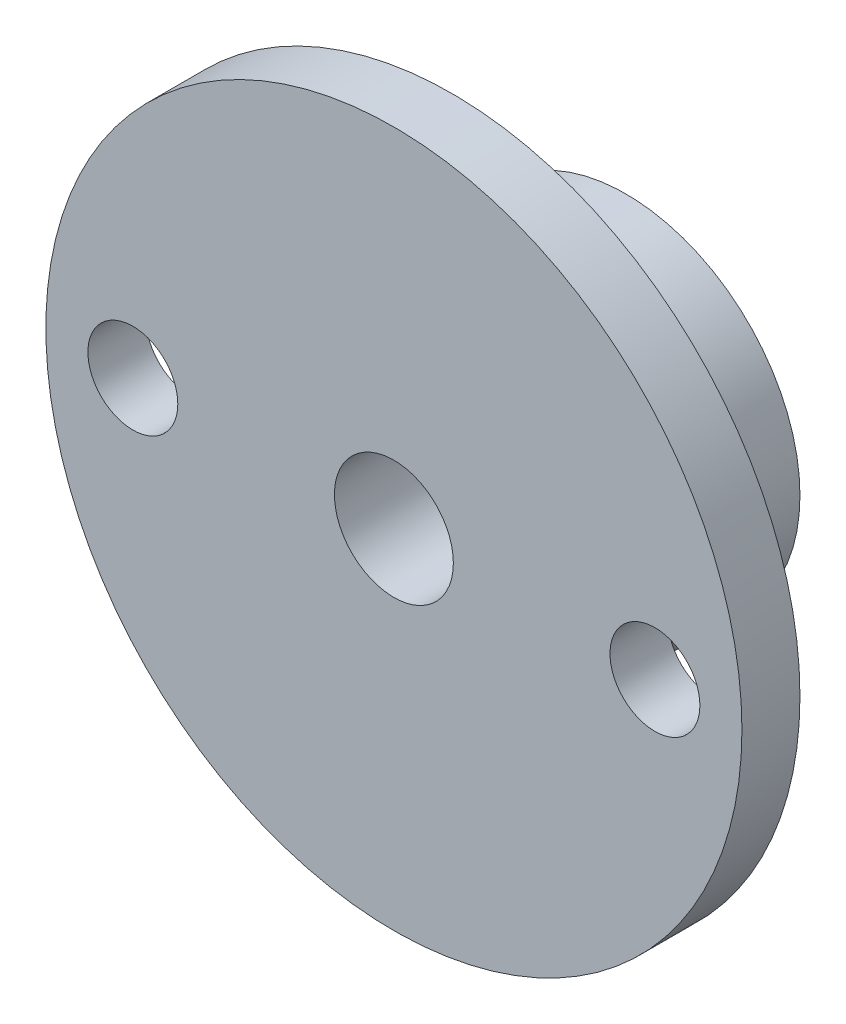
ISO-10303-21;
HEADER;
FILE_DESCRIPTION(('STEP AP214'),'2;1');
FILE_NAME('part.step','',(''),(''),'','','');
FILE_SCHEMA(('AUTOMOTIVE_DESIGN { 1 0 10303 214 1 1 1 1 }'));
ENDSEC;
DATA;
#1=APPLICATION_CONTEXT('core data for automotive mechanical design processes');
#2=APPLICATION_PROTOCOL_DEFINITION('international standard','automotive_design',2000,#1);
#3=PRODUCT_CONTEXT('',#1,'mechanical');
#4=PRODUCT('Part','Part','',(#3));
#5=PRODUCT_RELATED_PRODUCT_CATEGORY('part','',(#4));
#6=PRODUCT_DEFINITION_FORMATION('','',#4);
#7=PRODUCT_DEFINITION_CONTEXT('part definition',#1,'design');
#8=PRODUCT_DEFINITION('design','',#6,#7);
#9=PRODUCT_DEFINITION_SHAPE('','',#8);
#10=(LENGTH_UNIT() NAMED_UNIT(*) SI_UNIT(.MILLI.,.METRE.));
#11=(NAMED_UNIT(*) PLANE_ANGLE_UNIT() SI_UNIT($,.RADIAN.));
#12=(NAMED_UNIT(*) SI_UNIT($,.STERADIAN.) SOLID_ANGLE_UNIT());
#13=UNCERTAINTY_MEASURE_WITH_UNIT(LENGTH_MEASURE(1.E-05),#10,'distance_accuracy_value','');
#14=(GEOMETRIC_REPRESENTATION_CONTEXT(3) GLOBAL_UNCERTAINTY_ASSIGNED_CONTEXT((#13)) GLOBAL_UNIT_ASSIGNED_CONTEXT((#10,
#11,#12)) REPRESENTATION_CONTEXT('',''));
#15=CARTESIAN_POINT('',(0.,0.,0.));
#16=DIRECTION('',(0.,0.,1.));
#17=DIRECTION('',(1.,0.,0.));
#18=AXIS2_PLACEMENT_3D('',#15,#16,#17);
#19=CARTESIAN_POINT('',(0.,0.,6.));
#20=DIRECTION('',(0.,0.,-1.));
#21=DIRECTION('',(-1.,0.,0.));
#22=AXIS2_PLACEMENT_3D('',#19,#20,#21);
#23=CYLINDRICAL_SURFACE('',#22,6.);
#24=CARTESIAN_POINT('',(0.,-6.,4.5));
#25=CARTESIAN_POINT('',(0.0828760886697294,-5.99999859868013,4.49999767426184));
#26=CARTESIAN_POINT('',(0.165778157830762,-5.99826578131828,4.49310844922621));
#27=CARTESIAN_POINT('',(0.329206323770531,-5.99152113829892,4.465774848693));
#28=CARTESIAN_POINT('',(0.409731046870737,-5.98650745419968,4.44532279046215));
#29=CARTESIAN_POINT('',(0.566020872182575,-5.9737562633204,4.39156074653791));
#30=CARTESIAN_POINT('',(0.641791563430001,-5.96602202842087,4.35826620128472));
#31=CARTESIAN_POINT('',(0.786672131904424,-5.94865343807593,4.27981860995517));
#32=CARTESIAN_POINT('',(0.855781784348757,-5.9390190185405,4.23466516388106));
#33=CARTESIAN_POINT('',(0.986801927300918,-5.91867413591801,4.13279921034579));
#34=CARTESIAN_POINT('',(1.04855569006107,-5.90794707148533,4.07588842504082));
#35=CARTESIAN_POINT('',(1.1617489272033,-5.8867362011753,3.95254779509108));
#36=CARTESIAN_POINT('',(1.21318723694913,-5.87625242288349,3.8861168770535));
#37=CARTESIAN_POINT('',(1.30502654279903,-5.8565477569971,3.74440477326256));
#38=CARTESIAN_POINT('',(1.34525221592535,-5.84734794470605,3.6690067691896));
#39=CARTESIAN_POINT('',(1.41239690855053,-5.83149494812223,3.51225158834164));
#40=CARTESIAN_POINT('',(1.43931805543933,-5.82484135672789,3.43089536667424));
#41=CARTESIAN_POINT('',(1.47855483680429,-5.81500476717551,3.26625650179753));
#42=CARTESIAN_POINT('',(1.49115226833334,-5.81175491075426,3.1830451039502));
#43=CARTESIAN_POINT('',(1.50226177506785,-5.80889362537741,3.01563143098602));
#44=CARTESIAN_POINT('',(1.50077614181798,-5.80928160448644,2.93142931930139));
#45=CARTESIAN_POINT('',(1.48398652463928,-5.81359205496618,2.76658419225552));
#46=CARTESIAN_POINT('',(1.46901834019052,-5.81742863001879,2.68590437853491));
#47=CARTESIAN_POINT('',(1.4262241869031,-5.82806709676484,2.52823894908871));
#48=CARTESIAN_POINT('',(1.39839730206942,-5.83486919970697,2.45125359697102));
#49=CARTESIAN_POINT('',(1.33038947793715,-5.85075113904187,2.30226198374794));
#50=CARTESIAN_POINT('',(1.29008666723291,-5.85985327469421,2.23031382821045));
#51=CARTESIAN_POINT('',(1.19835627601495,-5.87929710846386,2.09408129024316));
#52=CARTESIAN_POINT('',(1.14692674880884,-5.88963902334735,2.02979825193275));
#53=CARTESIAN_POINT('',(1.03266342468122,-5.91075880539781,1.9087963843056));
#54=CARTESIAN_POINT('',(0.969546258165859,-5.92154069477971,1.85234550993865));
#55=CARTESIAN_POINT('',(0.834611917503699,-5.94205965578786,1.7507787575361));
#56=CARTESIAN_POINT('',(0.762794477707943,-5.95179669549415,1.70566322573644));
#57=CARTESIAN_POINT('',(0.612115888681391,-5.96917732094183,1.62794941377562));
#58=CARTESIAN_POINT('',(0.533231393208623,-5.97681360127725,1.59539465974557));
#59=CARTESIAN_POINT('',(0.370876008142882,-5.98907916991419,1.54408269429043));
#60=CARTESIAN_POINT('',(0.287405999150484,-5.99370903339281,1.52532284358186));
#61=CARTESIAN_POINT('',(0.120539970390026,-5.99935499271375,1.50254243444116));
#62=CARTESIAN_POINT('',(0.0371967199882084,-6.00046053508279,1.4981569739247));
#63=CARTESIAN_POINT('',(-0.129032874801509,-5.99918804814451,1.50324900205549));
#64=CARTESIAN_POINT('',(-0.211919259644596,-5.99681033241847,1.51272524279913));
#65=CARTESIAN_POINT('',(-0.373614268776493,-5.98889581127357,1.54497090839138));
#66=CARTESIAN_POINT('',(-0.452465118968756,-5.98340634185811,1.56754126347699));
#67=CARTESIAN_POINT('',(-0.605257292452512,-5.96988706634134,1.62510708402845));
#68=CARTESIAN_POINT('',(-0.679198119032636,-5.96185700369892,1.66010380431317));
#69=CARTESIAN_POINT('',(-0.821523134429848,-5.9439330792631,1.74223612887473));
#70=CARTESIAN_POINT('',(-0.889785441835831,-5.93400867366932,1.78957611239676));
#71=CARTESIAN_POINT('',(-1.01752661364325,-5.91344509187419,1.89478990879697));
#72=CARTESIAN_POINT('',(-1.07700395897301,-5.90280579251705,1.95266553961691));
#73=CARTESIAN_POINT('',(-1.18699056807273,-5.88168956960771,2.07900196084446));
#74=CARTESIAN_POINT('',(-1.23724386762203,-5.87122304187281,2.14768770300242));
#75=CARTESIAN_POINT('',(-1.3255107590127,-5.85192878377239,2.29273263446572));
#76=CARTESIAN_POINT('',(-1.36352489415794,-5.84310098067026,2.36909148295975));
#77=CARTESIAN_POINT('',(-1.42595142060929,-5.82818094734665,2.52690572241308));
#78=CARTESIAN_POINT('',(-1.45044439665407,-5.82207255291906,2.60832762834401));
#79=CARTESIAN_POINT('',(-1.48534565995378,-5.81326744090184,2.77430963788911));
#80=CARTESIAN_POINT('',(-1.49575702747866,-5.81056997719936,2.85886905103249));
#81=CARTESIAN_POINT('',(-1.502038590334,-5.80894901203957,3.0261210238552));
#82=CARTESIAN_POINT('',(-1.49831789778012,-5.80991932728264,3.10879743512473));
#83=CARTESIAN_POINT('',(-1.47737727831287,-5.81527909007843,3.27230388866798));
#84=CARTESIAN_POINT('',(-1.46015762268677,-5.81966846891857,3.35313396801365));
#85=CARTESIAN_POINT('',(-1.4129313194428,-5.83131260682723,3.51020845906541));
#86=CARTESIAN_POINT('',(-1.38300140468038,-5.83855015236309,3.58647730524021));
#87=CARTESIAN_POINT('',(-1.31126491360507,-5.85507755724829,3.73296538271369));
#88=CARTESIAN_POINT('',(-1.26945669003419,-5.86436770120773,3.80318377318692));
#89=CARTESIAN_POINT('',(-1.17386774863714,-5.88425634263512,3.93755462900202));
#90=CARTESIAN_POINT('',(-1.11980316291226,-5.89488264831757,4.00150107342396));
#91=CARTESIAN_POINT('',(-1.00178937118974,-5.91608027246286,4.11954704479541));
#92=CARTESIAN_POINT('',(-0.937837821261147,-5.9266515772706,4.17364423011297));
#93=CARTESIAN_POINT('',(-0.800467586702591,-5.94677655647663,4.27141130856461));
#94=CARTESIAN_POINT('',(-0.726898422316388,-5.95630833365868,4.31487461367158));
#95=CARTESIAN_POINT('',(-0.573266059510478,-5.97304924975118,4.38874746294053));
#96=CARTESIAN_POINT('',(-0.493207563436741,-5.98026005199781,4.41916636064854));
#97=CARTESIAN_POINT('',(-0.344410253243474,-5.99048059565542,4.46157183032965));
#98=CARTESIAN_POINT('',(-0.27638017090807,-5.99402585052691,4.47595124305343));
#99=CARTESIAN_POINT('',(-0.138906071536285,-5.99878605231948,4.49516594362194));
#100=CARTESIAN_POINT('',(-0.0694621612426181,-6.00000117450894,4.5000019493053));
#101=CARTESIAN_POINT('',(0.,-6.,4.5));
#102=B_SPLINE_CURVE_WITH_KNOTS('',3,(#24,#25,#26,#27,#28,#29,#30,#31,#32,#33,#34,#35,#36,#37,
#38,#39,#40,#41,#42,#43,#44,#45,#46,#47,#48,#49,#50,#51,#52,#53,#54,#55,#56,#57,#58,#59,#60,#61,
#62,#63,#64,#65,#66,#67,#68,#69,#70,#71,#72,#73,#74,#75,#76,#77,#78,#79,#80,#81,#82,#83,#84,#85,
#86,#87,#88,#89,#90,#91,#92,#93,#94,#95,#96,#97,#98,#99,#100,#101),.UNSPECIFIED.,.T.,.F.,(4,2,2,
2,2,2,2,2,2,2,2,2,2,2,2,2,2,2,2,2,2,2,2,2,2,2,2,2,2,2,2,2,2,2,2,2,2,2,4),(0.,0.24837371247189,
0.496888237763899,0.745104902286106,0.993329940169327,1.24614435437139,1.49898729580062,
1.75558647545807,2.01214461169368,2.2635629509943,2.51494038112697,2.76022497007018,
3.00552703466038,3.25330527873879,3.50112690836163,3.75601500969019,4.01091089558247,
4.26668229009114,4.52240473688643,4.77158308949276,5.02073901112743,5.26620274514037,
5.5116912732229,5.76153587565352,6.01142363008019,6.26744509204476,6.52345518749508,
6.77792254614036,7.03233423252408,7.27943780398612,7.52653640956034,7.77216400559447,
8.01782568136901,8.2698957640991,8.52202569770417,8.77872185499588,9.0352336382135,
9.24342242942149,9.45159556043039),.UNSPECIFIED.);
#103=CARTESIAN_POINT('',(0.,-6.,4.5));
#104=VERTEX_POINT('',#103);
#105=EDGE_CURVE('E72',#104,#104,#102,.T.);
#106=ORIENTED_EDGE('',*,*,#105,.T.);
#107=EDGE_LOOP('',(#106));
#108=FACE_BOUND('',#107,.T.);
#109=CARTESIAN_POINT('',(0.,0.,6.));
#110=DIRECTION('',(0.,0.,1.));
#111=DIRECTION('',(1.,0.,0.));
#112=AXIS2_PLACEMENT_3D('',#109,#110,#111);
#113=CIRCLE('',#112,6.);
#114=CARTESIAN_POINT('',(6.,0.,6.));
#115=VERTEX_POINT('',#114);
#116=EDGE_CURVE('E10',#115,#115,#113,.T.);
#117=ORIENTED_EDGE('',*,*,#116,.F.);
#118=EDGE_LOOP('',(#117));
#119=FACE_BOUND('',#118,.T.);
#120=CARTESIAN_POINT('',(0.,0.,0.));
#121=DIRECTION('',(0.,0.,1.));
#122=DIRECTION('',(1.,0.,0.));
#123=AXIS2_PLACEMENT_3D('',#120,#121,#122);
#124=CIRCLE('',#123,6.);
#125=CARTESIAN_POINT('',(6.,0.,0.));
#126=VERTEX_POINT('',#125);
#127=EDGE_CURVE('E42',#126,#126,#124,.T.);
#128=ORIENTED_EDGE('',*,*,#127,.T.);
#129=EDGE_LOOP('',(#128));
#130=FACE_BOUND('',#129,.T.);
#131=ADVANCED_FACE('F30',(#108,#119,#130),#23,.T.);
#132=CARTESIAN_POINT('',(0.,0.,0.));
#133=DIRECTION('',(0.,0.,1.));
#134=DIRECTION('',(1.,0.,0.));
#135=AXIS2_PLACEMENT_3D('',#132,#133,#134);
#136=PLANE('',#135);
#137=CARTESIAN_POINT('',(0.,0.,0.));
#138=DIRECTION('',(0.,0.,1.));
#139=DIRECTION('',(1.,0.,0.));
#140=AXIS2_PLACEMENT_3D('',#137,#138,#139);
#141=CIRCLE('',#140,2.05);
#142=CARTESIAN_POINT('',(2.05,0.,0.));
#143=VERTEX_POINT('',#142);
#144=EDGE_CURVE('E54',#143,#143,#141,.T.);
#145=ORIENTED_EDGE('',*,*,#144,.T.);
#146=EDGE_LOOP('',(#145));
#147=FACE_BOUND('',#146,.T.);
#148=ORIENTED_EDGE('',*,*,#127,.F.);
#149=EDGE_LOOP('',(#148));
#150=FACE_BOUND('',#149,.T.);
#151=ADVANCED_FACE('F99',(#147,#150),#136,.F.);
#152=CARTESIAN_POINT('',(0.,0.,6.));
#153=DIRECTION('',(0.,0.,1.));
#154=DIRECTION('',(1.,0.,0.));
#155=AXIS2_PLACEMENT_3D('',#152,#153,#154);
#156=PLANE('',#155);
#157=CARTESIAN_POINT('',(9.,0.,6.));
#158=DIRECTION('',(0.,0.,1.));
#159=DIRECTION('',(1.,0.,0.));
#160=AXIS2_PLACEMENT_3D('',#157,#158,#159);
#161=CIRCLE('',#160,1.55);
#162=CARTESIAN_POINT('',(10.55,0.,6.));
#163=VERTEX_POINT('',#162);
#164=EDGE_CURVE('E66',#163,#163,#161,.T.);
#165=ORIENTED_EDGE('',*,*,#164,.T.);
#166=EDGE_LOOP('',(#165));
#167=FACE_BOUND('',#166,.T.);
#168=CARTESIAN_POINT('',(-9.,0.,6.));
#169=DIRECTION('',(0.,0.,1.));
#170=DIRECTION('',(1.,0.,0.));
#171=AXIS2_PLACEMENT_3D('',#168,#169,#170);
#172=CIRCLE('',#171,1.55);
#173=CARTESIAN_POINT('',(-7.45,0.,6.));
#174=VERTEX_POINT('',#173);
#175=EDGE_CURVE('E60',#174,#174,#172,.T.);
#176=ORIENTED_EDGE('',*,*,#175,.T.);
#177=EDGE_LOOP('',(#176));
#178=FACE_BOUND('',#177,.T.);
#179=CARTESIAN_POINT('',(0.,0.,6.));
#180=DIRECTION('',(0.,0.,1.));
#181=DIRECTION('',(1.,0.,0.));
#182=AXIS2_PLACEMENT_3D('',#179,#180,#181);
#183=CIRCLE('',#182,12.);
#184=CARTESIAN_POINT('',(12.,0.,6.));
#185=VERTEX_POINT('',#184);
#186=EDGE_CURVE('E51',#185,#185,#183,.T.);
#187=ORIENTED_EDGE('',*,*,#186,.F.);
#188=EDGE_LOOP('',(#187));
#189=FACE_BOUND('',#188,.T.);
#190=ORIENTED_EDGE('',*,*,#116,.T.);
#191=EDGE_LOOP('',(#190));
#192=FACE_BOUND('',#191,.T.);
#193=ADVANCED_FACE('F95',(#167,#178,#189,#192),#156,.F.);
#194=CARTESIAN_POINT('',(0.,0.,8.));
#195=DIRECTION('',(0.,0.,-1.));
#196=DIRECTION('',(-1.,0.,0.));
#197=AXIS2_PLACEMENT_3D('',#194,#195,#196);
#198=CYLINDRICAL_SURFACE('',#197,12.);
#199=CARTESIAN_POINT('',(0.,0.,8.));
#200=DIRECTION('',(0.,0.,1.));
#201=DIRECTION('',(1.,0.,0.));
#202=AXIS2_PLACEMENT_3D('',#199,#200,#201);
#203=CIRCLE('',#202,12.);
#204=CARTESIAN_POINT('',(12.,0.,8.));
#205=VERTEX_POINT('',#204);
#206=EDGE_CURVE('E46',#205,#205,#203,.T.);
#207=ORIENTED_EDGE('',*,*,#206,.F.);
#208=EDGE_LOOP('',(#207));
#209=FACE_BOUND('',#208,.T.);
#210=ORIENTED_EDGE('',*,*,#186,.T.);
#211=EDGE_LOOP('',(#210));
#212=FACE_BOUND('',#211,.T.);
#213=ADVANCED_FACE('F98',(#209,#212),#198,.T.);
#214=CARTESIAN_POINT('',(0.,0.,8.));
#215=DIRECTION('',(0.,0.,1.));
#216=DIRECTION('',(1.,0.,0.));
#217=AXIS2_PLACEMENT_3D('',#214,#215,#216);
#218=PLANE('',#217);
#219=CARTESIAN_POINT('',(9.,0.,8.));
#220=DIRECTION('',(0.,0.,1.));
#221=DIRECTION('',(1.,0.,0.));
#222=AXIS2_PLACEMENT_3D('',#219,#220,#221);
#223=CIRCLE('',#222,1.55);
#224=CARTESIAN_POINT('',(10.55,0.,8.));
#225=VERTEX_POINT('',#224);
#226=EDGE_CURVE('E69',#225,#225,#223,.T.);
#227=ORIENTED_EDGE('',*,*,#226,.F.);
#228=EDGE_LOOP('',(#227));
#229=FACE_BOUND('',#228,.T.);
#230=CARTESIAN_POINT('',(-9.,0.,8.));
#231=DIRECTION('',(0.,0.,1.));
#232=DIRECTION('',(1.,0.,0.));
#233=AXIS2_PLACEMENT_3D('',#230,#231,#232);
#234=CIRCLE('',#233,1.55);
#235=CARTESIAN_POINT('',(-7.45,0.,8.));
#236=VERTEX_POINT('',#235);
#237=EDGE_CURVE('E63',#236,#236,#234,.T.);
#238=ORIENTED_EDGE('',*,*,#237,.F.);
#239=EDGE_LOOP('',(#238));
#240=FACE_BOUND('',#239,.T.);
#241=CARTESIAN_POINT('',(0.,0.,8.));
#242=DIRECTION('',(0.,0.,1.));
#243=DIRECTION('',(1.,0.,0.));
#244=AXIS2_PLACEMENT_3D('',#241,#242,#243);
#245=CIRCLE('',#244,2.05);
#246=CARTESIAN_POINT('',(2.05,0.,8.));
#247=VERTEX_POINT('',#246);
#248=EDGE_CURVE('E57',#247,#247,#245,.T.);
#249=ORIENTED_EDGE('',*,*,#248,.F.);
#250=EDGE_LOOP('',(#249));
#251=FACE_BOUND('',#250,.T.);
#252=ORIENTED_EDGE('',*,*,#206,.T.);
#253=EDGE_LOOP('',(#252));
#254=FACE_BOUND('',#253,.T.);
#255=ADVANCED_FACE('F93',(#229,#240,#251,#254),#218,.T.);
#256=CARTESIAN_POINT('',(0.,0.,0.));
#257=DIRECTION('',(0.,0.,1.));
#258=DIRECTION('',(1.,0.,0.));
#259=AXIS2_PLACEMENT_3D('',#256,#257,#258);
#260=CYLINDRICAL_SURFACE('',#259,2.05);
#261=CARTESIAN_POINT('',(0.,-2.05,4.5));
#262=CARTESIAN_POINT('',(-0.0736645541699394,-2.04999557455054,4.49999536487032));
#263=CARTESIAN_POINT('',(-0.147451361580436,-2.04598708706443,4.49452985480854));
#264=CARTESIAN_POINT('',(-0.292720171427363,-2.03031628176041,4.47300264589157));
#265=CARTESIAN_POINT('',(-0.364195790279564,-2.01863439721989,4.45691385773748));
#266=CARTESIAN_POINT('',(-0.502351269043643,-1.98874583853753,4.41521015882617));
#267=CARTESIAN_POINT('',(-0.569056984261831,-1.97057814890178,4.38965213123984));
#268=CARTESIAN_POINT('',(-0.696820466780423,-1.92910828401678,4.33019240013698));
#269=CARTESIAN_POINT('',(-0.757879974929626,-1.90580769889566,4.29629328024158));
#270=CARTESIAN_POINT('',(-0.878974600164132,-1.85327996587474,4.21781635944393));
#271=CARTESIAN_POINT('',(-0.938407453909169,-1.82370598176577,4.17254625481528));
#272=CARTESIAN_POINT('',(-1.04935746875454,-1.76220961079271,4.07440515478498));
#273=CARTESIAN_POINT('',(-1.10086192304519,-1.73028357291086,4.02152221546021));
#274=CARTESIAN_POINT('',(-1.20473615097505,-1.6600461859559,3.89796326977443));
#275=CARTESIAN_POINT('',(-1.25534711008369,-1.62169397672011,3.82582405496822));
#276=CARTESIAN_POINT('',(-1.34385567293754,-1.54913319052267,3.67222299041084));
#277=CARTESIAN_POINT('',(-1.38177233083955,-1.5149184529776,3.59077536135073));
#278=CARTESIAN_POINT('',(-1.43291459132733,-1.46631010290269,3.44771456900897));
#279=CARTESIAN_POINT('',(-1.45015813606169,-1.4491081113302,3.38850503166973));
#280=CARTESIAN_POINT('',(-1.47735605187029,-1.42137280086755,3.26698008652806));
#281=CARTESIAN_POINT('',(-1.4873267292953,-1.41082457094183,3.2046719634117));
#282=CARTESIAN_POINT('',(-1.49933424266878,-1.39806424591683,3.07791666053465));
#283=CARTESIAN_POINT('',(-1.50131036964724,-1.39591594223184,3.01345684708371));
#284=CARTESIAN_POINT('',(-1.49697487005051,-1.40056141611663,2.88512505475285));
#285=CARTESIAN_POINT('',(-1.49065746079277,-1.40736143292628,2.82125351733047));
#286=CARTESIAN_POINT('',(-1.46914421467263,-1.42981581835315,2.68923178006345));
#287=CARTESIAN_POINT('',(-1.45304431394653,-1.44636569534487,2.6213888526529));
#288=CARTESIAN_POINT('',(-1.41241800405743,-1.48606089204735,2.4902836175254));
#289=CARTESIAN_POINT('',(-1.38787183385896,-1.50922165684335,2.42703247688767));
#290=CARTESIAN_POINT('',(-1.32149425773126,-1.56803362426462,2.2846054484429));
#291=CARTESIAN_POINT('',(-1.27662069854312,-1.605233434408,2.20749468218742));
#292=CARTESIAN_POINT('',(-1.17456012669744,-1.68136246377685,2.0628485386396));
#293=CARTESIAN_POINT('',(-1.1173592530454,-1.72029359028535,1.99532408326575));
#294=CARTESIAN_POINT('',(-0.990371112630746,-1.79644834867789,1.86985179892646));
#295=CARTESIAN_POINT('',(-0.920423005713055,-1.8336414964417,1.81204695505277));
#296=CARTESIAN_POINT('',(-0.769268005228422,-1.90199023539516,1.70905319594615));
#297=CARTESIAN_POINT('',(-0.688087552764538,-1.9331596052877,1.66383538234152));
#298=CARTESIAN_POINT('',(-0.538207436597274,-1.97922123004423,1.59814062240448));
#299=CARTESIAN_POINT('',(-0.471634462119275,-1.99623772718083,1.57429332526309));
#300=CARTESIAN_POINT('',(-0.334527315040306,-2.02372535847694,1.53605216140614));
#301=CARTESIAN_POINT('',(-0.263996112133563,-2.03420133002224,1.52165130768186));
#302=CARTESIAN_POINT('',(-0.120600145325723,-2.04772049374847,1.50310319342416));
#303=CARTESIAN_POINT('',(-0.0477275087898649,-2.05073519152121,1.49899524047133));
#304=CARTESIAN_POINT('',(0.0977467281938146,-2.04895968464559,1.50142177556858));
#305=CARTESIAN_POINT('',(0.170348323545055,-2.04416933396684,1.50795646273963));
#306=CARTESIAN_POINT('',(0.308724365763488,-2.02774746830803,1.53053937748139));
#307=CARTESIAN_POINT('',(0.374648148974849,-2.01653935117606,1.54599926266328));
#308=CARTESIAN_POINT('',(0.502713167981759,-1.98848713080471,1.58516175245188));
#309=CARTESIAN_POINT('',(0.564853610518929,-1.97164185039048,1.60886607873626));
#310=CARTESIAN_POINT('',(0.689132816852739,-1.9318878201279,1.66578136118287));
#311=CARTESIAN_POINT('',(0.750866850830904,-1.90859948458405,1.69960507457239));
#312=CARTESIAN_POINT('',(0.867968847215969,-1.85827866471816,1.7746532538988));
#313=CARTESIAN_POINT('',(0.923332753094362,-1.83124381848865,1.81588239332167));
#314=CARTESIAN_POINT('',(1.03682397286532,-1.76985341439226,1.91300685825464));
#315=CARTESIAN_POINT('',(1.09360081170611,-1.73506384496132,1.97020532182987));
#316=CARTESIAN_POINT('',(1.19731087491147,-1.66518962228043,2.09285800989506));
#317=CARTESIAN_POINT('',(1.24423528561181,-1.6301047337781,2.15831954316177));
#318=CARTESIAN_POINT('',(1.32312902288905,-1.56656120372554,2.2896770634843));
#319=CARTESIAN_POINT('',(1.35615882476119,-1.53779480627221,2.35478433714041));
#320=CARTESIAN_POINT('',(1.41291272063144,-1.48581938303921,2.49098740743026));
#321=CARTESIAN_POINT('',(1.43665621646698,-1.46259881036972,2.56207033727716));
#322=CARTESIAN_POINT('',(1.46935149073412,-1.42965818089487,2.69266776876887));
#323=CARTESIAN_POINT('',(1.48043349891081,-1.41807300341029,2.75116597985044));
#324=CARTESIAN_POINT('',(1.49555161797816,-1.40212425294942,2.8700034275123));
#325=CARTESIAN_POINT('',(1.49959826077462,-1.39774988593687,2.93033977438546));
#326=CARTESIAN_POINT('',(1.5003451977955,-1.3969485321308,3.05124125605515));
#327=CARTESIAN_POINT('',(1.4970300729804,-1.40053822585011,3.11180660530967));
#328=CARTESIAN_POINT('',(1.48329148070309,-1.41507599115702,3.23124363534277));
#329=CARTESIAN_POINT('',(1.47285823479779,-1.42603418484414,3.29011287000658));
#330=CARTESIAN_POINT('',(1.44154573019902,-1.45776156448448,3.42160815870621));
#331=CARTESIAN_POINT('',(1.41850812555956,-1.48045941002889,3.49324268872674));
#332=CARTESIAN_POINT('',(1.36303990157746,-1.53168111814912,3.63058590116442));
#333=CARTESIAN_POINT('',(1.33058477026104,-1.56022012626716,3.6962785250729));
#334=CARTESIAN_POINT('',(1.24746944408314,-1.62785001356673,3.83799881911068));
#335=CARTESIAN_POINT('',(1.19426424774972,-1.6677337957351,3.91215634501249));
#336=CARTESIAN_POINT('',(1.07522193889443,-1.7468573131283,4.04984071490974));
#337=CARTESIAN_POINT('',(1.00939267395048,-1.78609743211258,4.11337411755238));
#338=CARTESIAN_POINT('',(0.877107798536321,-1.85413298021575,4.21929193666004));
#339=CARTESIAN_POINT('',(0.812406788660297,-1.88359794901534,4.26343243761176));
#340=CARTESIAN_POINT('',(0.67515746067032,-1.93702407432252,4.34178399156384));
#341=CARTESIAN_POINT('',(0.602617105963947,-1.96099074025875,4.37600499327855));
#342=CARTESIAN_POINT('',(0.462317192011554,-1.99830790110585,4.42864391198433));
#343=CARTESIAN_POINT('',(0.395431009217097,-2.01270292850566,4.44864837926339));
#344=CARTESIAN_POINT('',(0.258550164418264,-2.0348035590171,4.47920215510696));
#345=CARTESIAN_POINT('',(0.188564056942653,-2.04252649622795,4.48977596685669));
#346=CARTESIAN_POINT('',(0.0984524426773305,-2.04772982798432,4.49689598733902));
#347=CARTESIAN_POINT('',(0.0787929080878778,-2.048579801482,4.49805858516581));
#348=CARTESIAN_POINT('',(0.0394251721090265,-2.04971551310578,4.49961125748875));
#349=CARTESIAN_POINT('',(0.019716965240558,-2.05000118451044,4.50000124063319));
#350=CARTESIAN_POINT('',(0.,-2.05,4.5));
#351=B_SPLINE_CURVE_WITH_KNOTS('',3,(#261,#262,#263,#264,#265,#266,#267,#268,#269,#270,#271,
#272,#273,#274,#275,#276,#277,#278,#279,#280,#281,#282,#283,#284,#285,#286,#287,#288,#289,#290,
#291,#292,#293,#294,#295,#296,#297,#298,#299,#300,#301,#302,#303,#304,#305,#306,#307,#308,#309,
#310,#311,#312,#313,#314,#315,#316,#317,#318,#319,#320,#321,#322,#323,#324,#325,#326,#327,#328,
#329,#330,#331,#332,#333,#334,#335,#336,#337,#338,#339,#340,#341,#342,#343,#344,#345,#346,#347,
#348,#349,#350),.UNSPECIFIED.,.T.,.F.,(4,2,2,2,2,2,2,2,2,2,2,2,2,2,2,2,2,2,2,2,2,2,2,2,2,2,2,2,
2,2,2,2,2,2,2,2,2,2,2,2,2,2,2,2,4),(0.,0.220907485233337,0.442380470099748,0.662544051909396,
0.882639524557007,1.12282543414092,1.36339236819981,1.65048137899578,1.93713751648741,
2.12853026601187,2.31949256748167,2.51190230585803,2.70444627353801,2.91826981751639,
3.1325970669765,3.42110394211627,3.70993692667695,4.00270445801705,4.29479417832145,
4.51209357641629,4.72923206846164,4.9471985358974,5.16516908147474,5.37018833492614,
5.57525042805759,5.79685909676791,6.01860811491735,6.28096376393172,6.54355311721224,
6.77817738021138,7.01230879117284,7.19352509569975,7.37446988601036,7.55579401806688,
7.73736774510938,7.97186478758938,8.20697774023453,8.50435399328344,8.8015459822408,
9.05161167557909,9.30142569199744,9.51438706522724,9.72679348624617,9.7859143260036,
9.84504215561996),.UNSPECIFIED.);
#352=CARTESIAN_POINT('',(0.,-2.05,4.5));
#353=VERTEX_POINT('',#352);
#354=EDGE_CURVE('E34',#353,#353,#351,.T.);
#355=ORIENTED_EDGE('',*,*,#354,.T.);
#356=EDGE_LOOP('',(#355));
#357=FACE_BOUND('',#356,.T.);
#358=ORIENTED_EDGE('',*,*,#144,.F.);
#359=EDGE_LOOP('',(#358));
#360=FACE_BOUND('',#359,.T.);
#361=ORIENTED_EDGE('',*,*,#248,.T.);
#362=EDGE_LOOP('',(#361));
#363=FACE_BOUND('',#362,.T.);
#364=ADVANCED_FACE('F88',(#357,#360,#363),#260,.F.);
#365=CARTESIAN_POINT('',(-9.,0.,0.));
#366=DIRECTION('',(0.,0.,1.));
#367=DIRECTION('',(1.,0.,0.));
#368=AXIS2_PLACEMENT_3D('',#365,#366,#367);
#369=CYLINDRICAL_SURFACE('',#368,1.55);
#370=ORIENTED_EDGE('',*,*,#237,.T.);
#371=EDGE_LOOP('',(#370));
#372=FACE_BOUND('',#371,.T.);
#373=ORIENTED_EDGE('',*,*,#175,.F.);
#374=EDGE_LOOP('',(#373));
#375=FACE_BOUND('',#374,.T.);
#376=ADVANCED_FACE('F85',(#372,#375),#369,.F.);
#377=CARTESIAN_POINT('',(9.,0.,0.));
#378=DIRECTION('',(0.,0.,1.));
#379=DIRECTION('',(1.,0.,0.));
#380=AXIS2_PLACEMENT_3D('',#377,#378,#379);
#381=CYLINDRICAL_SURFACE('',#380,1.55);
#382=ORIENTED_EDGE('',*,*,#226,.T.);
#383=EDGE_LOOP('',(#382));
#384=FACE_BOUND('',#383,.T.);
#385=ORIENTED_EDGE('',*,*,#164,.F.);
#386=EDGE_LOOP('',(#385));
#387=FACE_BOUND('',#386,.T.);
#388=ADVANCED_FACE('F80',(#384,#387),#381,.F.);
#389=CARTESIAN_POINT('',(0.,-10.,3.));
#390=DIRECTION('',(0.,1.,0.));
#391=DIRECTION('',(0.,0.,1.));
#392=AXIS2_PLACEMENT_3D('',#389,#390,#391);
#393=CYLINDRICAL_SURFACE('',#392,1.5);
#394=ORIENTED_EDGE('',*,*,#354,.F.);
#395=EDGE_LOOP('',(#394));
#396=FACE_BOUND('',#395,.T.);
#397=ORIENTED_EDGE('',*,*,#105,.F.);
#398=EDGE_LOOP('',(#397));
#399=FACE_BOUND('',#398,.T.);
#400=ADVANCED_FACE('F76',(#396,#399),#393,.F.);
#401=CLOSED_SHELL('',(#131,#151,#193,#213,#255,#364,#376,#388,#400));
#402=MANIFOLD_SOLID_BREP('B2',#401);
#403=ADVANCED_BREP_SHAPE_REPRESENTATION('',(#18,#402),#14);
#404=SHAPE_DEFINITION_REPRESENTATION(#9,#403);
ENDSEC;
END-ISO-10303-21;
